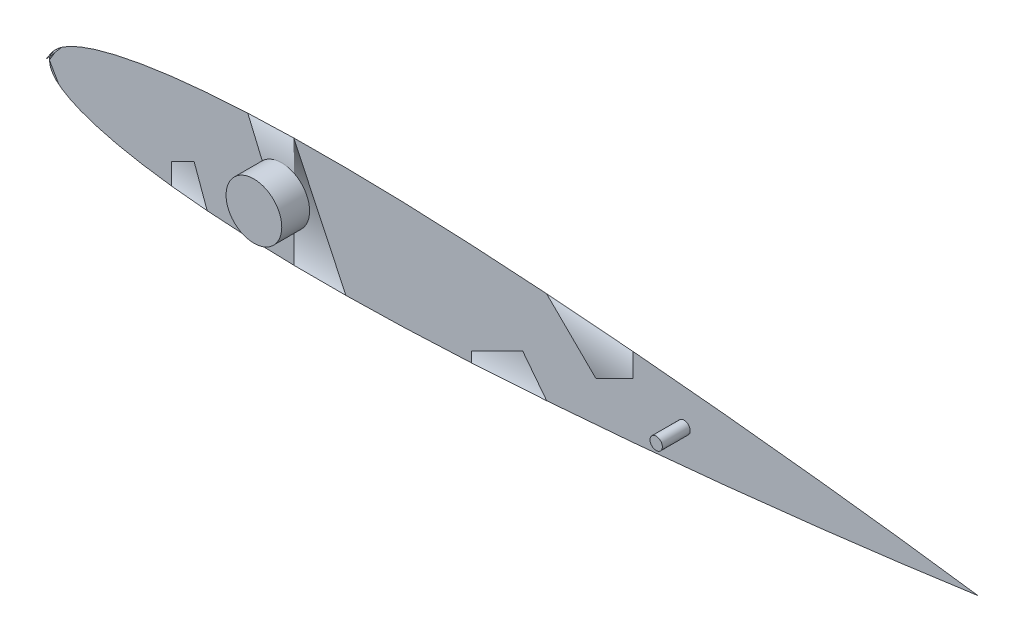
ISO-10303-21;
HEADER;
FILE_DESCRIPTION(('STEP AP214'),'2;1');
FILE_NAME('part.step','',(''),(''),'','','');
FILE_SCHEMA(('AUTOMOTIVE_DESIGN { 1 0 10303 214 1 1 1 1 }'));
ENDSEC;
DATA;
#1=APPLICATION_CONTEXT('core data for automotive mechanical design processes');
#2=APPLICATION_PROTOCOL_DEFINITION('international standard','automotive_design',2000,#1);
#3=PRODUCT_CONTEXT('',#1,'mechanical');
#4=PRODUCT('Part','Part','',(#3));
#5=PRODUCT_RELATED_PRODUCT_CATEGORY('part','',(#4));
#6=PRODUCT_DEFINITION_FORMATION('','',#4);
#7=PRODUCT_DEFINITION_CONTEXT('part definition',#1,'design');
#8=PRODUCT_DEFINITION('design','',#6,#7);
#9=PRODUCT_DEFINITION_SHAPE('','',#8);
#10=(LENGTH_UNIT() NAMED_UNIT(*) SI_UNIT(.MILLI.,.METRE.));
#11=(NAMED_UNIT(*) PLANE_ANGLE_UNIT() SI_UNIT($,.RADIAN.));
#12=(NAMED_UNIT(*) SI_UNIT($,.STERADIAN.) SOLID_ANGLE_UNIT());
#13=UNCERTAINTY_MEASURE_WITH_UNIT(LENGTH_MEASURE(1.E-05),#10,'distance_accuracy_value','');
#14=(GEOMETRIC_REPRESENTATION_CONTEXT(3) GLOBAL_UNCERTAINTY_ASSIGNED_CONTEXT((#13)) GLOBAL_UNIT_ASSIGNED_CONTEXT((#10,
#11,#12)) REPRESENTATION_CONTEXT('',''));
#15=CARTESIAN_POINT('',(0.,0.,0.));
#16=DIRECTION('',(0.,0.,1.));
#17=DIRECTION('',(1.,0.,0.));
#18=AXIS2_PLACEMENT_3D('',#15,#16,#17);
#19=CARTESIAN_POINT('',(300.,0.378,0.));
#20=CARTESIAN_POINT('',(299.270664383389,0.274715927514747,0.));
#21=CARTESIAN_POINT('',(297.235644822472,-0.0134711609143953,0.));
#22=CARTESIAN_POINT('',(293.66188706616,-0.517648368768993,0.));
#23=CARTESIAN_POINT('',(289.116216890102,-1.14567437048845,0.));
#24=CARTESIAN_POINT('',(284.086326820832,-1.82862683956845,0.));
#25=CARTESIAN_POINT('',(278.759319181652,-2.5356579979903,0.));
#26=CARTESIAN_POINT('',(273.274947399262,-3.24630496920069,0.));
#27=CARTESIAN_POINT('',(267.716770565143,-3.95438730802297,0.));
#28=CARTESIAN_POINT('',(262.127119667931,-4.65252458674648,0.));
#29=CARTESIAN_POINT('',(256.522609544875,-5.33577280479802,0.));
#30=CARTESIAN_POINT('',(250.907670074419,-6.00572355362823,0.));
#31=CARTESIAN_POINT('',(245.287128241019,-6.66367781164042,0.));
#32=CARTESIAN_POINT('',(239.666523216507,-7.30829728912314,0.));
#33=CARTESIAN_POINT('',(234.045875017305,-7.93722257969058,0.));
#34=CARTESIAN_POINT('',(228.421360753791,-8.55063599856626,0.));
#35=CARTESIAN_POINT('',(222.792027229128,-9.15167164715295,0.));
#36=CARTESIAN_POINT('',(217.161155701911,-9.74024549330965,0.));
#37=CARTESIAN_POINT('',(211.532072831273,-10.313913855383,0.));
#38=CARTESIAN_POINT('',(205.905672996003,-10.8727958777843,0.));
#39=CARTESIAN_POINT('',(200.280917117814,-11.4162137627421,0.));
#40=CARTESIAN_POINT('',(194.657137744867,-11.9441197945868,0.));
#41=CARTESIAN_POINT('',(189.034785382448,-12.4555844554776,0.));
#42=CARTESIAN_POINT('',(183.41474961795,-12.9509342678522,0.));
#43=CARTESIAN_POINT('',(177.797629596961,-13.4283700233909,0.));
#44=CARTESIAN_POINT('',(172.183844389062,-13.8873786896539,0.));
#45=CARTESIAN_POINT('',(166.574165122115,-14.3281001832085,-1.0151811652087E-13));
#46=CARTESIAN_POINT('',(160.969413798737,-14.7486326950089,-1.04405363474301E-13));
#47=CARTESIAN_POINT('',(155.370374113793,-15.1476162313168,-1.07142185109572E-13));
#48=CARTESIAN_POINT('',(149.77713751235,-15.5252610720565,-1.09730050606963E-13));
#49=CARTESIAN_POINT('',(144.189159966366,-15.8785404297556,-1.12147819252653E-13));
#50=CARTESIAN_POINT('',(138.606964264769,-16.2081830151236,-1.14400584202062E-13));
#51=CARTESIAN_POINT('',(133.032892905545,-16.5122076268174,-1.16474531421667E-13));
#52=CARTESIAN_POINT('',(127.470152498246,-16.7890407126634,-1.18358701077526E-13));
#53=CARTESIAN_POINT('',(121.920939189973,-17.0367055333658,-1.20039309006729E-13));
#54=CARTESIAN_POINT('',(116.384603149714,-17.2520228570151,-1.21494149051575E-13));
#55=CARTESIAN_POINT('',(110.859760402153,-17.4333683215467,-1.22711866184454E-13));
#56=CARTESIAN_POINT('',(105.345907109752,-17.579082490513,-1.23680868198755E-13));
#57=CARTESIAN_POINT('',(99.8454621888375,-17.6885378121447,-1.24396794210274E-13));
#58=CARTESIAN_POINT('',(94.3624877033805,-17.7588537348622,-1.24839565190981E-13));
#59=CARTESIAN_POINT('',(88.900867374333,-17.7861511023058,-1.24982127329317E-13));
#60=CARTESIAN_POINT('',(83.4636907017531,-17.7689620935671,-1.24814258077844E-13));
#61=CARTESIAN_POINT('',(78.0533389483398,-17.7025228200589,-1.24302712358366E-13));
#62=CARTESIAN_POINT('',(72.6729976093295,-17.5839539564704,-1.23427411993322E-13));
#63=CARTESIAN_POINT('',(67.3268251627243,-17.4098058831512,-1.22164305025042E-13));
#64=CARTESIAN_POINT('',(62.0208434540107,-17.1752777461348,-1.20479920279431E-13));
#65=CARTESIAN_POINT('',(56.7634038506075,-16.8780426915389,-1.18358082915292E-13));
#66=CARTESIAN_POINT('',(51.5669468667858,-16.5110619958682,-1.15749751286365E-13));
#67=CARTESIAN_POINT('',(46.4488544740899,-16.07318869877,-1.12647069153401E-13));
#68=CARTESIAN_POINT('',(41.4335119740808,-15.557306212348,-1.09000556242883E-13));
#69=CARTESIAN_POINT('',(36.5534910706751,-14.9618966396169,-1.04799899728213E-13));
#70=CARTESIAN_POINT('',(31.855109723379,-14.28539421479,-1.00034573463789E-13));
#71=CARTESIAN_POINT('',(27.4003586399194,-13.5344698642654,0.));
#72=CARTESIAN_POINT('',(23.2673562368522,-12.7239902003647,0.));
#73=CARTESIAN_POINT('',(19.5326195102958,-11.8710663211694,0.));
#74=CARTESIAN_POINT('',(16.2460522388496,-11.0036927484647,0.));
#75=CARTESIAN_POINT('',(13.4147846537565,-10.141303252311,0.));
#76=CARTESIAN_POINT('',(11.0084148335825,-9.30578710171615,0.));
#77=CARTESIAN_POINT('',(8.98300858716987,-8.49945272321373,0.));
#78=CARTESIAN_POINT('',(7.28679132627897,-7.72863785664429,0.));
#79=CARTESIAN_POINT('',(5.86370065180114,-6.99587133278891,0.));
#80=CARTESIAN_POINT('',(4.66357390014857,-6.28890181380823,0.));
#81=CARTESIAN_POINT('',(3.64235212288972,-5.5973527278402,0.));
#82=CARTESIAN_POINT('',(2.76431556027216,-4.91968480838791,0.));
#83=CARTESIAN_POINT('',(2.0169607643998,-4.2448480041596,0.));
#84=CARTESIAN_POINT('',(1.39957876094043,-3.56674388417613,0.));
#85=CARTESIAN_POINT('',(0.908282736866717,-2.88866255544339,0.));
#86=CARTESIAN_POINT('',(0.534868798057665,-2.21887845150204,0.));
#87=CARTESIAN_POINT('',(0.264426180113878,-1.56579755465484,0.));
#88=CARTESIAN_POINT('',(0.0880585885130629,-0.930816976309561,0.));
#89=CARTESIAN_POINT('',(-0.00273060512217582,-0.30898887668204,0.));
#90=CARTESIAN_POINT('',(-0.0042878669629155,0.30897119019244,0.));
#91=CARTESIAN_POINT('',(0.0833661748852899,0.931248967487221,0.));
#92=CARTESIAN_POINT('',(0.256531239611388,1.56711036952479,0.));
#93=CARTESIAN_POINT('',(0.523678910685444,2.22154599605105,0.));
#94=CARTESIAN_POINT('',(0.893712411047864,2.89320359051338,0.));
#95=CARTESIAN_POINT('',(1.38158468166933,3.57375242726562,0.));
#96=CARTESIAN_POINT('',(1.99554121542088,4.25495952529098,0.));
#97=CARTESIAN_POINT('',(2.73948535802705,4.93355440880156,0.));
#98=CARTESIAN_POINT('',(3.61409533886002,5.61563900459307,0.));
#99=CARTESIAN_POINT('',(4.63181875506184,6.31232624043906,0.));
#100=CARTESIAN_POINT('',(5.82836715466117,7.02533539113786,0.));
#101=CARTESIAN_POINT('',(7.24774662970238,7.76526494767973,0.));
#102=CARTESIAN_POINT('',(8.94005745615438,8.54461893491802,0.));
#103=CARTESIAN_POINT('',(10.961374085603,9.36115099365771,0.));
#104=CARTESIAN_POINT('',(13.3635022994865,10.2087849458385,0.));
#105=CARTESIAN_POINT('',(16.1903877948378,11.0854312874995,0.));
#106=CARTESIAN_POINT('',(19.4725404358988,11.9693660090616,0.));
#107=CARTESIAN_POINT('',(23.2029370365688,12.8410664944534,0.));
#108=CARTESIAN_POINT('',(27.3317596579179,13.6725154987807,0.));
#109=CARTESIAN_POINT('',(31.7827739483678,14.4452516932167,1.0059093180988E-13));
#110=CARTESIAN_POINT('',(36.4775824059328,15.1460775508,1.05443461337986E-13));
#111=CARTESIAN_POINT('',(41.3545835273676,15.7658923319561,1.09728690965082E-13));
#112=CARTESIAN_POINT('',(46.3672543301102,16.3070967676803,1.13463794226474E-13));
#113=CARTESIAN_POINT('',(51.4830770434221,16.7707454259069,1.16656421233291E-13));
#114=CARTESIAN_POINT('',(56.6776178535577,17.1639153494202,1.19356205653484E-13));
#115=CARTESIAN_POINT('',(61.9334927895796,17.487642944238,1.21570537619166E-13));
#116=CARTESIAN_POINT('',(67.2382250476964,17.7489104091285,1.23348283302525E-13));
#117=CARTESIAN_POINT('',(72.5834519037709,17.950000773942,1.24705458582789E-13));
#118=CARTESIAN_POINT('',(77.9631273208796,18.0956849437657,1.25675431681887E-13));
#119=CARTESIAN_POINT('',(83.3730755072506,18.1893914107472,1.26282180354335E-13));
#120=CARTESIAN_POINT('',(88.8100964911278,18.2339834426122,1.26545726830961E-13));
#121=CARTESIAN_POINT('',(94.2717850315885,18.2342128568073,1.26499274011881E-13));
#122=CARTESIAN_POINT('',(99.7550442696497,18.1915318870559,1.26152990030729E-13));
#123=CARTESIAN_POINT('',(105.255970982933,18.1098000659247,1.25533860180582E-13));
#124=CARTESIAN_POINT('',(110.770488641121,17.9918774358821,1.24661891882858E-13));
#125=CARTESIAN_POINT('',(116.296175195771,17.8383793493988,1.23541403427938E-13));
#126=CARTESIAN_POINT('',(121.833526114498,17.6509677611882,1.2218399581496E-13));
#127=CARTESIAN_POINT('',(127.383917168299,17.4312739878833,1.2060104835329E-13));
#128=CARTESIAN_POINT('',(132.947982156676,17.1824804961485,1.18814778494726E-13));
#129=CARTESIAN_POINT('',(138.523514997704,16.9065529316445,1.16838931668928E-13));
#130=CARTESIAN_POINT('',(144.107301191893,16.6050486653246,1.14684411213362E-13));
#131=CARTESIAN_POINT('',(149.696988285799,16.2799370672355,1.1236498985277E-13));
#132=CARTESIAN_POINT('',(155.29205716982,15.9304868010793,1.0987556526453E-13));
#133=CARTESIAN_POINT('',(160.893036610152,15.559727357774,1.07237287601502E-13));
#134=CARTESIAN_POINT('',(166.499836222695,15.1674479991852,1.04448686083572E-13));
#135=CARTESIAN_POINT('',(172.111665468202,14.7550047519749,1.01519236742374E-13));
#136=CARTESIAN_POINT('',(177.727692769424,14.324295258161,0.));
#137=CARTESIAN_POINT('',(183.347147713469,13.8751757164873,0.));
#138=CARTESIAN_POINT('',(188.969608650407,13.4081570407772,0.));
#139=CARTESIAN_POINT('',(194.594467374293,12.9250353968196,0.));
#140=CARTESIAN_POINT('',(200.220835954698,12.4254797828249,0.));
#141=CARTESIAN_POINT('',(205.84825920731,11.9104174342923,0.));
#142=CARTESIAN_POINT('',(211.477404335005,11.3798994302267,0.));
#143=CARTESIAN_POINT('',(217.109306986788,10.8346087967207,0.));
#144=CARTESIAN_POINT('',(222.743073395715,10.2744218832285,0.));
#145=CARTESIAN_POINT('',(228.375364628807,9.70176557408474,0.));
#146=CARTESIAN_POINT('',(234.002899045624,9.11670736289857,0.));
#147=CARTESIAN_POINT('',(239.626645626691,8.51611799216187,0.));
#148=CARTESIAN_POINT('',(245.250428131942,7.89983441623858,0.));
#149=CARTESIAN_POINT('',(250.874214653857,7.27021591066598,0.));
#150=CARTESIAN_POINT('',(256.492459346009,6.62857283086514,0.));
#151=CARTESIAN_POINT('',(262.100341842146,5.97357988707039,0.));
#152=CARTESIAN_POINT('',(267.693440341672,5.3036231815645,0.));
#153=CARTESIAN_POINT('',(273.255115300712,4.62356291374719,0.));
#154=CARTESIAN_POINT('',(278.742999071091,3.94056607042551,0.));
#155=CARTESIAN_POINT('',(284.073502473293,3.2603918824645,0.));
#156=CARTESIAN_POINT('',(289.106770723188,2.60279861260758,0.));
#157=CARTESIAN_POINT('',(293.655548401755,1.99769065586514,0.));
#158=CARTESIAN_POINT('',(297.231801809653,1.51153150474877,0.));
#159=CARTESIAN_POINT('',(299.268247980284,1.23360452625148,0.));
#160=CARTESIAN_POINT('',(299.998094883025,1.13399759955261,0.));
#161=B_SPLINE_CURVE_WITH_KNOTS('',3,(#19,#20,#21,#22,#23,#24,#25,#26,#27,#28,#29,#30,#31,#32,
#33,#34,#35,#36,#37,#38,#39,#40,#41,#42,#43,#44,#45,#46,#47,#48,#49,#50,#51,#52,#53,#54,#55,#56,
#57,#58,#59,#60,#61,#62,#63,#64,#65,#66,#67,#68,#69,#70,#71,#72,#73,#74,#75,#76,#77,#78,#79,#80,
#81,#82,#83,#84,#85,#86,#87,#88,#89,#90,#91,#92,#93,#94,#95,#96,#97,#98,#99,#100,#101,#102,#103,
#104,#105,#106,#107,#108,#109,#110,#111,#112,#113,#114,#115,#116,#117,#118,#119,#120,#121,#122,
#123,#124,#125,#126,#127,#128,#129,#130,#131,#132,#133,#134,#135,#136,#137,#138,#139,#140,#141,
#142,#143,#144,#145,#146,#147,#148,#149,#150,#151,#152,#153,#154,#155,#156,#157,#158,#159,#160),
.UNSPECIFIED.,.F.,.F.,(4,1,1,1,1,1,1,1,1,1,1,1,1,1,1,1,1,1,1,1,1,1,1,1,1,1,1,1,1,1,1,1,1,1,1,1,
1,1,1,1,1,1,1,1,1,1,1,1,1,1,1,1,1,1,1,1,1,1,1,1,1,1,1,1,1,1,1,1,1,1,1,1,1,1,1,1,1,1,1,1,1,1,1,1,
1,1,1,1,1,1,1,1,1,1,1,1,1,1,1,1,1,1,1,1,1,1,1,1,1,1,1,1,1,1,1,1,1,1,1,1,1,1,1,1,1,1,1,1,1,1,1,1,
1,1,1,1,1,1,1,4),(0.,0.00361222059404388,0.0100789532278554,0.0176986181570895,
0.0261151107220122,0.0349709660638799,0.0440503796486832,0.0532343297369713,0.0624475697827881,
0.0716739929600303,0.0809213185094618,0.0901775382979332,0.0994243421366575,0.108664440992277,
0.117912199004999,0.127169502180609,0.136426594565023,0.145675425736823,0.154916495397513,
0.164153236916375,0.173386648526191,0.182615736180586,0.191838089492061,0.201053134496137,
0.210260392550908,0.219458942389608,0.228646746886173,0.237822316287067,0.24698522413025,
0.25613738364592,0.265279415916296,0.274406949966901,0.283512193452554,0.292591781113348,
0.30164628535433,0.310681792653752,0.31969906757785,0.32869451957993,0.337660159695399,
0.346588583205171,0.355477411634764,0.364322937295264,0.373121613643215,0.381867635356829,
0.390553004884712,0.399166025869356,0.407689628257838,0.416098119030288,0.424354887451602,
0.432412428746428,0.440204728485537,0.447630505181733,0.454563637698397,0.460855379429517,
0.466413319364109,0.471228610451128,0.475365774282038,0.478901259753558,0.481915077255184,
0.484498871900912,0.486747127386087,0.488741251833575,0.490543179252672,0.492182103901344,
0.493672830547239,0.495031907807012,0.496279059618418,0.497424736506128,0.498490165528455,
0.499502757789975,0.500497253863142,0.501509846124661,0.502575275146988,0.503720952034698,
0.504968103846104,0.506327181105877,0.507817907751772,0.509456832400444,0.511258759819541,
0.51325288426703,0.515501139752205,0.518084934397933,0.521098751899559,0.524634237371078,
0.528771401201989,0.533586692289008,0.539144632223599,0.545436373954719,0.552369506471383,
0.559795200118754,0.567587571253572,0.575645112548398,0.583901880969712,0.592310371742162,
0.600833974130644,0.609446995115288,0.618132364643171,0.626878386356785,0.635677062704736,
0.644522588365236,0.653411416794829,0.662339840304601,0.67130548042007,0.68030093242215,
0.689318207346248,0.69835371464567,0.707408218886652,0.716487806547446,0.725593050033099,
0.734720584083704,0.74386261635408,0.75301477586975,0.762177683712933,0.771353253113827,
0.780541057610392,0.789739607449093,0.798946865503863,0.808161910507939,0.817384263819414,
0.826613351473809,0.835846763083625,0.845083504602487,0.854324574263177,0.863573405434977,
0.872830497819391,0.882087800995001,0.891335559007723,0.900575657863343,0.909822461702067,
0.919078681490538,0.92832600703997,0.937552430217212,0.946765670263029,0.955949620351317,
0.96502903393612,0.973884889277988,0.982301381842911,0.989921046772145,0.996387779405956,1.),.UNSPECIFIED.);
#162=CARTESIAN_POINT('',(0.,0.,0.));
#163=DIRECTION('',(-0.999999206200945,-0.00125999899981319,0.));
#164=AXIS1_PLACEMENT('',#162,#163);
#165=SURFACE_OF_REVOLUTION('',#161,#164);
#166=CARTESIAN_POINT('',(300.,0.378,0.));
#167=VERTEX_POINT('',#166);
#168=CARTESIAN_POINT('',(6.80646112573174E-05,8.57614101842199E-08,0.));
#169=VERTEX_POINT('',#168);
#170=EDGE_CURVE('E11',#167,#169,#161,.T.);
#171=ORIENTED_EDGE('',*,*,#170,.F.);
#172=CARTESIAN_POINT('',(300.,0.378,0.));
#173=CARTESIAN_POINT('',(299.270406423722,0.479445821702214,0.));
#174=CARTESIAN_POINT('',(297.234667094079,0.762503753929249,0.));
#175=CARTESIAN_POINT('',(293.659650160598,1.25767350567471,0.));
#176=CARTESIAN_POINT('',(289.112411794917,1.87424244263157,0.));
#177=CARTESIAN_POINT('',(284.080816659039,2.54451744035308,0.));
#178=CARTESIAN_POINT('',(278.752044218456,3.23812231587444,0.));
#179=CARTESIAN_POINT('',(273.265899022491,3.9349464356921,0.));
#180=CARTESIAN_POINT('',(267.705955472007,4.62901994282977,0.));
#181=CARTESIAN_POINT('',(262.114563019877,5.31306910693311,0.));
#182=CARTESIAN_POINT('',(256.508348909457,5.98219181245048,0.));
#183=CARTESIAN_POINT('',(250.891738994322,6.63799080905485,0.));
#184=CARTESIAN_POINT('',(245.26955696514,7.28177923500018,0.));
#185=CARTESIAN_POINT('',(239.647345348641,7.91223276351523,0.));
#186=CARTESIAN_POINT('',(234.025130106877,8.52699204614705,0.));
#187=CARTESIAN_POINT('',(228.39908790293,9.12622976387373,0.));
#188=CARTESIAN_POINT('',(222.768257645069,9.71307760609444,0.));
#189=CARTESIAN_POINT('',(217.135920793229,10.2874598096935,0.));
#190=CARTESIAN_POINT('',(211.505410154049,10.8469410839445,0.));
#191=CARTESIAN_POINT('',(205.877619803235,11.3916428267113,0.));
#192=CARTESIAN_POINT('',(200.251512373847,11.9208846239016,0.));
#193=CARTESIAN_POINT('',(194.626420536407,12.4346170780212,0.));
#194=CARTESIAN_POINT('',(189.002797137155,12.9319118094523,0.));
#195=CARTESIAN_POINT('',(183.38153093782,13.4130975813525,0.));
#196=CARTESIAN_POINT('',(177.763225616089,13.8763767009594,0.));
#197=CARTESIAN_POINT('',(172.14830153305,14.3212371935158,0.));
#198=CARTESIAN_POINT('',(166.537529461527,14.7478209183839,0.));
#199=CARTESIAN_POINT('',(160.93173619408,15.1542281439998,0.));
#200=CARTESIAN_POINT('',(155.331708850263,15.5391008558515,0.));
#201=CARTESIAN_POINT('',(149.737538344949,15.9026495636367,0.));
#202=CARTESIAN_POINT('',(144.148688279315,16.2418461185451,0.));
#203=CARTESIAN_POINT('',(138.565679604281,16.5574205463986,0.));
#204=CARTESIAN_POINT('',(132.990859803015,16.8473975552302,0.));
#205=CARTESIAN_POINT('',(127.427439440233,17.1102116785059,0.));
#206=CARTESIAN_POINT('',(121.877619637436,17.3438917174883,0.));
#207=CARTESIAN_POINT('',(116.34075857733,17.5452568127912,0.));
#208=CARTESIAN_POINT('',(110.815476382376,17.7126791198953,0.));
#209=CARTESIAN_POINT('',(105.301273398412,17.8444979379533,0.));
#210=CARTESIAN_POINT('',(99.8005701155099,17.9400918128482,0.));
#211=CARTESIAN_POINT('',(94.317435843722,17.9965904385316,0.));
#212=CARTESIAN_POINT('',(88.8557640671271,18.010124457922,0.));
#213=CARTESIAN_POINT('',(83.4186479748764,17.9792338402997,0.));
#214=CARTESIAN_POINT('',(78.0084808270881,17.8991607129759,0.));
#215=CARTESIAN_POINT('',(72.6284553647725,17.7670337872177,0.));
#216=CARTESIAN_POINT('',(67.282738745755,17.5794139336759,0.));
#217=CARTESIAN_POINT('',(61.9773648945349,17.331515488654,0.));
#218=CARTESIAN_POINT('',(56.7206910156758,17.0210326510704,0.));
#219=CARTESIAN_POINT('',(51.525175321503,16.6409580698254,0.));
#220=CARTESIAN_POINT('',(46.4082026187052,16.1901885907069,0.));
#221=CARTESIAN_POINT('',(41.3941760651881,15.6616690992775,0.));
#222=CARTESIAN_POINT('',(36.5156710865414,15.053963783935,0.));
#223=CARTESIAN_POINT('',(31.8190094409261,14.365623604937,0.));
#224=CARTESIAN_POINT('',(27.3661648285288,13.6034756838357,0.));
#225=CARTESIAN_POINT('',(23.2352179540604,12.7825834438453,0.));
#226=CARTESIAN_POINT('',(19.5026424507845,11.9202507512404,0.));
#227=CARTESIAN_POINT('',(16.2182713927633,11.0445977962405,0.));
#228=CARTESIAN_POINT('',(13.3891860155768,10.1750762553544,0.));
#229=CARTESIAN_POINT('',(10.9849293334529,9.33349871536662,0.));
#230=CARTESIAN_POINT('',(8.96156147750793,8.52206288149523,0.));
#231=CARTESIAN_POINT('',(7.26729205281745,7.74697600170196,0.));
#232=CARTESIAN_POINT('',(5.84605246563846,7.01062562171688,0.));
#233=CARTESIAN_POINT('',(4.64771108498173,6.3006340328895,0.));
#234=CARTESIAN_POINT('',(3.62823525123104,5.60651366793159,0.));
#235=CARTESIAN_POINT('',(2.7519091969966,4.92663525158207,0.));
#236=CARTESIAN_POINT('',(2.00625736016822,4.24991725899655,0.));
#237=CARTESIAN_POINT('',(1.39058613668651,3.57025949194714,0.));
#238=CARTESIAN_POINT('',(0.901000434809036,2.89094225223971,0.));
#239=CARTESIAN_POINT('',(0.529275534924336,2.2202192733616,0.));
#240=CARTESIAN_POINT('',(0.260479536935831,1.56645893585832,0.));
#241=CARTESIAN_POINT('',(0.0857126538535384,0.931035928074943,0.));
#242=CARTESIAN_POINT('',(-0.00350924718502504,0.308981014468132,0.));
#243=CARTESIAN_POINT('',(-0.00350924718493213,-0.308981014556266,0.));
#244=CARTESIAN_POINT('',(0.0857126538538091,-0.931035928163009,0.));
#245=CARTESIAN_POINT('',(0.260479536936281,-1.56645893594634,0.));
#246=CARTESIAN_POINT('',(0.529275534925014,-2.22021927344958,0.));
#247=CARTESIAN_POINT('',(0.901000434809843,-2.8909422523276,0.));
#248=CARTESIAN_POINT('',(1.39058613668764,-3.57025949203449,0.));
#249=CARTESIAN_POINT('',(2.00625736016919,-4.24991725908573,0.));
#250=CARTESIAN_POINT('',(2.75190919699924,-4.92663525166222,0.));
#251=CARTESIAN_POINT('',(3.62823525122755,-5.60651366804955,0.));
#252=CARTESIAN_POINT('',(4.64771108500617,-6.30063403284057,0.));
#253=CARTESIAN_POINT('',(5.84605246553824,-7.01062562241641,0.));
#254=CARTESIAN_POINT('',(7.26729205329512,-7.74697599893915,0.));
#255=CARTESIAN_POINT('',(8.96156147526015,-8.52206289506444,0.));
#256=CARTESIAN_POINT('',(10.9849293441557,-9.33349865133622,0.));
#257=CARTESIAN_POINT('',(13.3891859649821,-10.1750765586253,0.));
#258=CARTESIAN_POINT('',(16.2182716296946,-11.0445963766246,0.));
#259=CARTESIAN_POINT('',(19.502641361243,-11.9202572799972,0.));
#260=CARTESIAN_POINT('',(23.2352227989122,-12.7825544130606,0.));
#261=CARTESIAN_POINT('',(27.3661275586091,-13.6035961608879,0.));
#262=CARTESIAN_POINT('',(31.8190750083393,-14.3651133635312,0.));
#263=CARTESIAN_POINT('',(36.5156346373294,-15.0541060973255,0.));
#264=CARTESIAN_POINT('',(41.3941822041036,-15.6616288871344,0.));
#265=CARTESIAN_POINT('',(46.408200923652,-16.1901996940606,0.));
#266=CARTESIAN_POINT('',(51.5251757859932,-16.6409550273418,0.));
#267=CARTESIAN_POINT('',(56.7206908890832,-17.0210334804045,0.));
#268=CARTESIAN_POINT('',(61.9773649289213,-17.3315152635127,0.));
#269=CARTESIAN_POINT('',(67.2827387364453,-17.5794139947604,0.));
#270=CARTESIAN_POINT('',(72.6284553672972,-17.7670337707804,0.));
#271=CARTESIAN_POINT('',(78.0084808264127,-17.8991607175001,0.));
#272=CARTESIAN_POINT('',(83.4186479750654,-17.9792338391595,0.));
#273=CARTESIAN_POINT('',(88.8557640670829,-18.0101244583088,0.));
#274=CARTESIAN_POINT('',(94.3174358437406,-17.9965904385044,0.));
#275=CARTESIAN_POINT('',(99.8005701155117,-17.9400918129306,0.));
#276=CARTESIAN_POINT('',(105.301273398418,-17.8444979380042,0.));
#277=CARTESIAN_POINT('',(110.815476382381,-17.7126791199525,0.));
#278=CARTESIAN_POINT('',(116.340758577336,-17.5452568128447,0.));
#279=CARTESIAN_POINT('',(121.877619637441,-17.3438917175407,0.));
#280=CARTESIAN_POINT('',(127.427439440238,-17.1102116785565,0.));
#281=CARTESIAN_POINT('',(132.990859803021,-16.8473975552792,0.));
#282=CARTESIAN_POINT('',(138.565679604286,-16.557420546446,0.));
#283=CARTESIAN_POINT('',(144.14868827932,-16.2418461185909,0.));
#284=CARTESIAN_POINT('',(149.737538344954,-15.9026495636808,0.));
#285=CARTESIAN_POINT('',(155.331708850268,-15.539100855894,0.));
#286=CARTESIAN_POINT('',(160.931736194084,-15.1542281440407,0.));
#287=CARTESIAN_POINT('',(166.537529461531,-14.7478209184231,0.));
#288=CARTESIAN_POINT('',(172.148301533054,-14.3212371935533,0.));
#289=CARTESIAN_POINT('',(177.763225616093,-13.8763767009953,0.));
#290=CARTESIAN_POINT('',(183.381530937824,-13.4130975813867,0.));
#291=CARTESIAN_POINT('',(189.002797137158,-12.9319118094849,0.));
#292=CARTESIAN_POINT('',(194.626420536411,-12.4346170780521,0.));
#293=CARTESIAN_POINT('',(200.25151237385,-11.9208846239309,0.));
#294=CARTESIAN_POINT('',(205.877619803239,-11.391642826739,0.));
#295=CARTESIAN_POINT('',(211.505410154052,-10.8469410839704,0.));
#296=CARTESIAN_POINT('',(217.135920793232,-10.2874598097179,0.));
#297=CARTESIAN_POINT('',(222.768257645072,-9.71307760611713,0.));
#298=CARTESIAN_POINT('',(228.399087902932,-9.12622976389475,0.));
#299=CARTESIAN_POINT('',(234.025130106879,-8.52699204616642,0.));
#300=CARTESIAN_POINT('',(239.647345348643,-7.91223276353295,0.));
#301=CARTESIAN_POINT('',(245.269556965142,-7.28177923501625,0.));
#302=CARTESIAN_POINT('',(250.891738994324,-6.63799080906928,0.));
#303=CARTESIAN_POINT('',(256.508348909459,-5.98219181246325,0.));
#304=CARTESIAN_POINT('',(262.114563019879,-5.31306910694424,0.));
#305=CARTESIAN_POINT('',(267.705955472008,-4.62901994283926,0.));
#306=CARTESIAN_POINT('',(273.265899022492,-3.93494643569995,0.));
#307=CARTESIAN_POINT('',(278.752044218457,-3.23812231588068,0.));
#308=CARTESIAN_POINT('',(284.08081665904,-2.54451744035776,0.));
#309=CARTESIAN_POINT('',(289.112411794917,-1.87424244263477,0.));
#310=CARTESIAN_POINT('',(293.659650160598,-1.25767350567657,0.));
#311=CARTESIAN_POINT('',(297.234667094079,-0.762503753930066,0.));
#312=CARTESIAN_POINT('',(299.270406423723,-0.479445821702428,0.));
#313=CARTESIAN_POINT('',(300.,-0.378,0.));
#314=B_SPLINE_CURVE_WITH_KNOTS('',3,(#172,#173,#174,#175,#176,#177,#178,#179,#180,#181,#182,
#183,#184,#185,#186,#187,#188,#189,#190,#191,#192,#193,#194,#195,#196,#197,#198,#199,#200,#201,
#202,#203,#204,#205,#206,#207,#208,#209,#210,#211,#212,#213,#214,#215,#216,#217,#218,#219,#220,
#221,#222,#223,#224,#225,#226,#227,#228,#229,#230,#231,#232,#233,#234,#235,#236,#237,#238,#239,
#240,#241,#242,#243,#244,#245,#246,#247,#248,#249,#250,#251,#252,#253,#254,#255,#256,#257,#258,
#259,#260,#261,#262,#263,#264,#265,#266,#267,#268,#269,#270,#271,#272,#273,#274,#275,#276,#277,
#278,#279,#280,#281,#282,#283,#284,#285,#286,#287,#288,#289,#290,#291,#292,#293,#294,#295,#296,
#297,#298,#299,#300,#301,#302,#303,#304,#305,#306,#307,#308,#309,#310,#311,#312,#313),
.UNSPECIFIED.,.F.,.F.,(4,1,1,1,1,1,1,1,1,1,1,1,1,1,1,1,1,1,1,1,1,1,1,1,1,1,1,1,1,1,1,1,1,1,1,1,
1,1,1,1,1,1,1,1,1,1,1,1,1,1,1,1,1,1,1,1,1,1,1,1,1,1,1,1,1,1,1,1,1,1,1,1,1,1,1,1,1,1,1,1,1,1,1,1,
1,1,1,1,1,1,1,1,1,1,1,1,1,1,1,1,1,1,1,1,1,1,1,1,1,1,1,1,1,1,1,1,1,1,1,1,1,1,1,1,1,1,1,1,1,1,1,1,
1,1,1,1,1,1,1,4),(0.,0.00361222059404388,0.0100789532278554,0.0176986181570895,
0.0261151107220122,0.0349709660638799,0.0440503796486832,0.0532343297369713,0.0624475697827881,
0.0716739929600303,0.0809213185094618,0.0901775382979332,0.0994243421366575,0.108664440992277,
0.117912199004999,0.127169502180609,0.136426594565023,0.145675425736823,0.154916495397513,
0.164153236916375,0.173386648526191,0.182615736180586,0.191838089492061,0.201053134496137,
0.210260392550908,0.219458942389608,0.228646746886173,0.237822316287067,0.24698522413025,
0.25613738364592,0.265279415916296,0.274406949966901,0.283512193452554,0.292591781113348,
0.30164628535433,0.310681792653752,0.31969906757785,0.32869451957993,0.337660159695399,
0.346588583205171,0.355477411634764,0.364322937295264,0.373121613643215,0.381867635356829,
0.390553004884712,0.399166025869356,0.407689628257838,0.416098119030288,0.424354887451602,
0.432412428746428,0.440204728485537,0.447630505181733,0.454563637698397,0.460855379429517,
0.466413319364109,0.471228610451128,0.475365774282038,0.478901259753558,0.481915077255184,
0.484498871900912,0.486747127386087,0.488741251833575,0.490543179252672,0.492182103901344,
0.493672830547239,0.495031907807012,0.496279059618418,0.497424736506128,0.498490165528455,
0.499502757789975,0.500497253863142,0.501509846124661,0.502575275146988,0.503720952034698,
0.504968103846104,0.506327181105877,0.507817907751772,0.509456832400444,0.511258759819541,
0.51325288426703,0.515501139752205,0.518084934397933,0.521098751899559,0.524634237371078,
0.528771401201989,0.533586692289008,0.539144632223599,0.545436373954719,0.552369506471383,
0.559795200118754,0.567587571253572,0.575645112548398,0.583901880969712,0.592310371742162,
0.600833974130644,0.609446995115288,0.618132364643171,0.626878386356785,0.635677062704736,
0.644522588365236,0.653411416794829,0.662339840304601,0.67130548042007,0.68030093242215,
0.689318207346248,0.69835371464567,0.707408218886652,0.716487806547446,0.725593050033099,
0.734720584083704,0.74386261635408,0.75301477586975,0.762177683712933,0.771353253113827,
0.780541057610392,0.789739607449093,0.798946865503863,0.808161910507939,0.817384263819414,
0.826613351473809,0.835846763083625,0.845083504602487,0.854324574263177,0.863573405434977,
0.872830497819391,0.882087800995001,0.891335559007723,0.900575657863343,0.909822461702067,
0.919078681490538,0.92832600703997,0.937552430217212,0.946765670263029,0.955949620351317,
0.96502903393612,0.973884889277988,0.982301381842911,0.989921046772145,0.996387779405956,1.),.UNSPECIFIED.);
#315=EDGE_CURVE('E47',#167,#169,#314,.T.);
#316=ORIENTED_EDGE('',*,*,#315,.T.);
#317=EDGE_LOOP('',(#171,#316));
#318=FACE_BOUND('',#317,.T.);
#319=ADVANCED_FACE('F37',(#318),#165,.T.);
#320=CARTESIAN_POINT('',(0.,0.,0.));
#321=DIRECTION('',(0.,0.,-1.));
#322=DIRECTION('',(0.999996824805041,0.00251999599925435,0.));
#323=AXIS2_PLACEMENT_3D('',#320,#321,#322);
#324=PLANE('',#323);
#325=CARTESIAN_POINT('',(75.0000680646113,0.,0.));
#326=DIRECTION('',(0.,0.,1.));
#327=DIRECTION('',(1.,0.,0.));
#328=AXIS2_PLACEMENT_3D('',#325,#326,#327);
#329=CIRCLE('',#328,9.);
#330=CARTESIAN_POINT('',(84.0000680646113,0.,0.));
#331=VERTEX_POINT('',#330);
#332=EDGE_CURVE('E85',#331,#331,#329,.T.);
#333=ORIENTED_EDGE('',*,*,#332,.T.);
#334=EDGE_LOOP('',(#333));
#335=FACE_BOUND('',#334,.T.);
#336=CARTESIAN_POINT('',(205.000068064611,0.,0.));
#337=DIRECTION('',(0.,0.,1.));
#338=DIRECTION('',(1.,0.,0.));
#339=AXIS2_PLACEMENT_3D('',#336,#337,#338);
#340=CIRCLE('',#339,2.);
#341=CARTESIAN_POINT('',(207.000068064611,0.,0.));
#342=VERTEX_POINT('',#341);
#343=EDGE_CURVE('E92',#342,#342,#340,.T.);
#344=ORIENTED_EDGE('',*,*,#343,.T.);
#345=EDGE_LOOP('',(#344));
#346=FACE_BOUND('',#345,.T.);
#347=ORIENTED_EDGE('',*,*,#170,.T.);
#348=ORIENTED_EDGE('',*,*,#315,.F.);
#349=EDGE_LOOP('',(#347,#348));
#350=FACE_BOUND('',#349,.T.);
#351=ADVANCED_FACE('F54',(#335,#346,#350),#324,.T.);
#352=CARTESIAN_POINT('',(205.000068064611,0.,9.));
#353=DIRECTION('',(0.,0.,-1.));
#354=DIRECTION('',(-1.,0.,0.));
#355=AXIS2_PLACEMENT_3D('',#352,#353,#354);
#356=CYLINDRICAL_SURFACE('',#355,2.);
#357=CARTESIAN_POINT('',(205.000068064611,0.,9.));
#358=DIRECTION('',(0.,0.,1.));
#359=DIRECTION('',(1.,0.,0.));
#360=AXIS2_PLACEMENT_3D('',#357,#358,#359);
#361=CIRCLE('',#360,2.);
#362=CARTESIAN_POINT('',(207.000068064611,0.,9.));
#363=VERTEX_POINT('',#362);
#364=EDGE_CURVE('E87',#363,#363,#361,.T.);
#365=ORIENTED_EDGE('',*,*,#364,.T.);
#366=EDGE_LOOP('',(#365));
#367=FACE_BOUND('',#366,.T.);
#368=ORIENTED_EDGE('',*,*,#343,.F.);
#369=EDGE_LOOP('',(#368));
#370=FACE_BOUND('',#369,.T.);
#371=ADVANCED_FACE('F60',(#367,#370),#356,.F.);
#372=CARTESIAN_POINT('',(205.000068064611,0.,9.));
#373=DIRECTION('',(0.,0.,1.));
#374=DIRECTION('',(1.,0.,0.));
#375=AXIS2_PLACEMENT_3D('',#372,#373,#374);
#376=PLANE('',#375);
#377=ORIENTED_EDGE('',*,*,#364,.F.);
#378=EDGE_LOOP('',(#377));
#379=FACE_BOUND('',#378,.T.);
#380=ADVANCED_FACE('F65',(#379),#376,.F.);
#381=CARTESIAN_POINT('',(75.0000680646113,0.,9.));
#382=DIRECTION('',(0.,0.,-1.));
#383=DIRECTION('',(-1.,0.,0.));
#384=AXIS2_PLACEMENT_3D('',#381,#382,#383);
#385=CYLINDRICAL_SURFACE('',#384,9.);
#386=CARTESIAN_POINT('',(75.0000680646113,0.,9.));
#387=DIRECTION('',(0.,0.,1.));
#388=DIRECTION('',(1.,0.,0.));
#389=AXIS2_PLACEMENT_3D('',#386,#387,#388);
#390=CIRCLE('',#389,9.);
#391=CARTESIAN_POINT('',(84.0000680646113,0.,9.));
#392=VERTEX_POINT('',#391);
#393=EDGE_CURVE('E55',#392,#392,#390,.T.);
#394=ORIENTED_EDGE('',*,*,#393,.T.);
#395=EDGE_LOOP('',(#394));
#396=FACE_BOUND('',#395,.T.);
#397=ORIENTED_EDGE('',*,*,#332,.F.);
#398=EDGE_LOOP('',(#397));
#399=FACE_BOUND('',#398,.T.);
#400=ADVANCED_FACE('F73',(#396,#399),#385,.F.);
#401=CARTESIAN_POINT('',(75.0000680646113,0.,9.));
#402=DIRECTION('',(0.,0.,1.));
#403=DIRECTION('',(1.,0.,0.));
#404=AXIS2_PLACEMENT_3D('',#401,#402,#403);
#405=PLANE('',#404);
#406=ORIENTED_EDGE('',*,*,#393,.F.);
#407=EDGE_LOOP('',(#406));
#408=FACE_BOUND('',#407,.T.);
#409=ADVANCED_FACE('F77',(#408),#405,.F.);
#410=CLOSED_SHELL('',(#319,#351,#371,#380,#400,#409));
#411=MANIFOLD_SOLID_BREP('B2',#410);
#412=ADVANCED_BREP_SHAPE_REPRESENTATION('',(#18,#411),#14);
#413=SHAPE_DEFINITION_REPRESENTATION(#9,#412);
ENDSEC;
END-ISO-10303-21;
